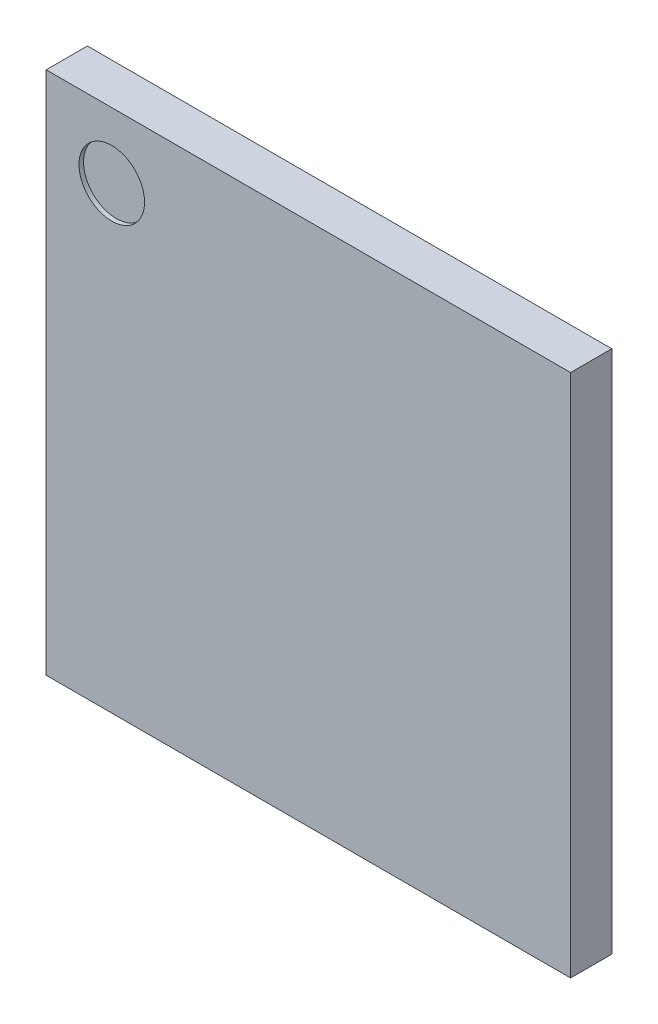
ISO-10303-21;
HEADER;
FILE_DESCRIPTION(('STEP AP214'),'2;1');
FILE_NAME('part.step','',(''),(''),'','','');
FILE_SCHEMA(('AUTOMOTIVE_DESIGN { 1 0 10303 214 1 1 1 1 }'));
ENDSEC;
DATA;
#1=APPLICATION_CONTEXT('core data for automotive mechanical design processes');
#2=APPLICATION_PROTOCOL_DEFINITION('international standard','automotive_design',2000,#1);
#3=PRODUCT_CONTEXT('',#1,'mechanical');
#4=PRODUCT('Part','Part','',(#3));
#5=PRODUCT_RELATED_PRODUCT_CATEGORY('part','',(#4));
#6=PRODUCT_DEFINITION_FORMATION('','',#4);
#7=PRODUCT_DEFINITION_CONTEXT('part definition',#1,'design');
#8=PRODUCT_DEFINITION('design','',#6,#7);
#9=PRODUCT_DEFINITION_SHAPE('','',#8);
#10=(LENGTH_UNIT() NAMED_UNIT(*) SI_UNIT(.MILLI.,.METRE.));
#11=(NAMED_UNIT(*) PLANE_ANGLE_UNIT() SI_UNIT($,.RADIAN.));
#12=(NAMED_UNIT(*) SI_UNIT($,.STERADIAN.) SOLID_ANGLE_UNIT());
#13=UNCERTAINTY_MEASURE_WITH_UNIT(LENGTH_MEASURE(1.E-05),#10,'distance_accuracy_value','');
#14=(GEOMETRIC_REPRESENTATION_CONTEXT(3) GLOBAL_UNCERTAINTY_ASSIGNED_CONTEXT((#13)) GLOBAL_UNIT_ASSIGNED_CONTEXT((#10,
#11,#12)) REPRESENTATION_CONTEXT('',''));
#15=CARTESIAN_POINT('',(0.,0.,0.));
#16=DIRECTION('',(0.,0.,1.));
#17=DIRECTION('',(1.,0.,0.));
#18=AXIS2_PLACEMENT_3D('',#15,#16,#17);
#19=CARTESIAN_POINT('',(-3.5,-3.5,0.05));
#20=DIRECTION('',(1.,0.,0.));
#21=DIRECTION('',(0.,0.,1.));
#22=AXIS2_PLACEMENT_3D('',#19,#20,#21);
#23=PLANE('',#22);
#24=DIRECTION('',(0.,1.,0.));
#25=VECTOR('',#24,1.);
#26=CARTESIAN_POINT('',(-3.5,-3.5,0.6));
#27=LINE('',#26,#25);
#28=CARTESIAN_POINT('',(-3.5,-3.5,0.6));
#29=VERTEX_POINT('',#28);
#30=CARTESIAN_POINT('',(-3.5,3.5,0.6));
#31=VERTEX_POINT('',#30);
#32=EDGE_CURVE('E11',#29,#31,#27,.T.);
#33=ORIENTED_EDGE('',*,*,#32,.T.);
#34=DIRECTION('',(0.,0.,1.));
#35=VECTOR('',#34,1.);
#36=CARTESIAN_POINT('',(-3.5,3.5,0.05));
#37=LINE('',#36,#35);
#38=CARTESIAN_POINT('',(-3.5,3.5,0.05));
#39=VERTEX_POINT('',#38);
#40=EDGE_CURVE('E23',#39,#31,#37,.T.);
#41=ORIENTED_EDGE('',*,*,#40,.F.);
#42=DIRECTION('',(0.,1.,0.));
#43=VECTOR('',#42,1.);
#44=CARTESIAN_POINT('',(-3.5,-3.5,0.05));
#45=LINE('',#44,#43);
#46=CARTESIAN_POINT('',(-3.5,-3.5,0.05));
#47=VERTEX_POINT('',#46);
#48=EDGE_CURVE('E94',#47,#39,#45,.T.);
#49=ORIENTED_EDGE('',*,*,#48,.F.);
#50=DIRECTION('',(0.,0.,1.));
#51=VECTOR('',#50,1.);
#52=CARTESIAN_POINT('',(-3.5,-3.5,0.05));
#53=LINE('',#52,#51);
#54=EDGE_CURVE('E35',#47,#29,#53,.T.);
#55=ORIENTED_EDGE('',*,*,#54,.T.);
#56=EDGE_LOOP('',(#33,#41,#49,#55));
#57=FACE_BOUND('',#56,.T.);
#58=ADVANCED_FACE('F16',(#57),#23,.F.);
#59=CARTESIAN_POINT('',(-3.5,-3.5,0.05));
#60=DIRECTION('',(0.,1.,0.));
#61=DIRECTION('',(0.,0.,1.));
#62=AXIS2_PLACEMENT_3D('',#59,#60,#61);
#63=PLANE('',#62);
#64=DIRECTION('',(0.,0.,1.));
#65=VECTOR('',#64,1.);
#66=CARTESIAN_POINT('',(3.5,-3.5,0.05));
#67=LINE('',#66,#65);
#68=CARTESIAN_POINT('',(3.5,-3.5,0.05));
#69=VERTEX_POINT('',#68);
#70=CARTESIAN_POINT('',(3.5,-3.5,0.6));
#71=VERTEX_POINT('',#70);
#72=EDGE_CURVE('E90',#69,#71,#67,.T.);
#73=ORIENTED_EDGE('',*,*,#72,.T.);
#74=DIRECTION('',(1.,0.,0.));
#75=VECTOR('',#74,1.);
#76=CARTESIAN_POINT('',(-3.5,-3.5,0.6));
#77=LINE('',#76,#75);
#78=EDGE_CURVE('E88',#29,#71,#77,.T.);
#79=ORIENTED_EDGE('',*,*,#78,.F.);
#80=ORIENTED_EDGE('',*,*,#54,.F.);
#81=DIRECTION('',(1.,0.,0.));
#82=VECTOR('',#81,1.);
#83=CARTESIAN_POINT('',(-3.5,-3.5,0.05));
#84=LINE('',#83,#82);
#85=EDGE_CURVE('E86',#47,#69,#84,.T.);
#86=ORIENTED_EDGE('',*,*,#85,.T.);
#87=EDGE_LOOP('',(#73,#79,#80,#86));
#88=FACE_BOUND('',#87,.T.);
#89=ADVANCED_FACE('F108',(#88),#63,.F.);
#90=CARTESIAN_POINT('',(-3.5,-3.5,0.6));
#91=DIRECTION('',(0.,0.,1.));
#92=DIRECTION('',(1.,0.,0.));
#93=AXIS2_PLACEMENT_3D('',#90,#91,#92);
#94=PLANE('',#93);
#95=ORIENTED_EDGE('',*,*,#32,.F.);
#96=ORIENTED_EDGE('',*,*,#78,.T.);
#97=DIRECTION('',(0.,1.,0.));
#98=VECTOR('',#97,1.);
#99=CARTESIAN_POINT('',(3.5,-3.5,0.6));
#100=LINE('',#99,#98);
#101=CARTESIAN_POINT('',(3.5,3.5,0.6));
#102=VERTEX_POINT('',#101);
#103=EDGE_CURVE('E84',#71,#102,#100,.T.);
#104=ORIENTED_EDGE('',*,*,#103,.T.);
#105=DIRECTION('',(1.,0.,0.));
#106=VECTOR('',#105,1.);
#107=CARTESIAN_POINT('',(-3.5,3.5,0.6));
#108=LINE('',#107,#106);
#109=EDGE_CURVE('E82',#31,#102,#108,.T.);
#110=ORIENTED_EDGE('',*,*,#109,.F.);
#111=EDGE_LOOP('',(#95,#96,#104,#110));
#112=FACE_BOUND('',#111,.T.);
#113=CARTESIAN_POINT('',(-2.625,2.625,0.6));
#114=DIRECTION('',(0.,0.,1.));
#115=DIRECTION('',(1.,0.,0.));
#116=AXIS2_PLACEMENT_3D('',#113,#114,#115);
#117=CIRCLE('',#116,0.4375);
#118=CARTESIAN_POINT('',(-2.1875,2.625,0.6));
#119=VERTEX_POINT('',#118);
#120=EDGE_CURVE('E67',#119,#119,#117,.T.);
#121=ORIENTED_EDGE('',*,*,#120,.F.);
#122=EDGE_LOOP('',(#121));
#123=FACE_BOUND('',#122,.T.);
#124=ADVANCED_FACE('F110',(#112,#123),#94,.T.);
#125=CARTESIAN_POINT('',(-3.5,3.5,0.05));
#126=DIRECTION('',(0.,1.,0.));
#127=DIRECTION('',(0.,0.,1.));
#128=AXIS2_PLACEMENT_3D('',#125,#126,#127);
#129=PLANE('',#128);
#130=DIRECTION('',(1.,0.,0.));
#131=VECTOR('',#130,1.);
#132=CARTESIAN_POINT('',(-3.5,3.5,0.05));
#133=LINE('',#132,#131);
#134=CARTESIAN_POINT('',(3.5,3.5,0.05));
#135=VERTEX_POINT('',#134);
#136=EDGE_CURVE('E79',#39,#135,#133,.T.);
#137=ORIENTED_EDGE('',*,*,#136,.F.);
#138=ORIENTED_EDGE('',*,*,#40,.T.);
#139=ORIENTED_EDGE('',*,*,#109,.T.);
#140=DIRECTION('',(0.,0.,1.));
#141=VECTOR('',#140,1.);
#142=CARTESIAN_POINT('',(3.5,3.5,0.05));
#143=LINE('',#142,#141);
#144=EDGE_CURVE('E74',#135,#102,#143,.T.);
#145=ORIENTED_EDGE('',*,*,#144,.F.);
#146=EDGE_LOOP('',(#137,#138,#139,#145));
#147=FACE_BOUND('',#146,.T.);
#148=ADVANCED_FACE('F101',(#147),#129,.T.);
#149=CARTESIAN_POINT('',(-3.5,-3.5,0.05));
#150=DIRECTION('',(0.,0.,1.));
#151=DIRECTION('',(1.,0.,0.));
#152=AXIS2_PLACEMENT_3D('',#149,#150,#151);
#153=PLANE('',#152);
#154=ORIENTED_EDGE('',*,*,#136,.T.);
#155=DIRECTION('',(0.,1.,0.));
#156=VECTOR('',#155,1.);
#157=CARTESIAN_POINT('',(3.5,-3.5,0.05));
#158=LINE('',#157,#156);
#159=EDGE_CURVE('E71',#69,#135,#158,.T.);
#160=ORIENTED_EDGE('',*,*,#159,.F.);
#161=ORIENTED_EDGE('',*,*,#85,.F.);
#162=ORIENTED_EDGE('',*,*,#48,.T.);
#163=EDGE_LOOP('',(#154,#160,#161,#162));
#164=FACE_BOUND('',#163,.T.);
#165=ADVANCED_FACE('F97',(#164),#153,.F.);
#166=CARTESIAN_POINT('',(3.5,-3.5,0.05));
#167=DIRECTION('',(1.,0.,0.));
#168=DIRECTION('',(0.,0.,1.));
#169=AXIS2_PLACEMENT_3D('',#166,#167,#168);
#170=PLANE('',#169);
#171=ORIENTED_EDGE('',*,*,#72,.F.);
#172=ORIENTED_EDGE('',*,*,#159,.T.);
#173=ORIENTED_EDGE('',*,*,#144,.T.);
#174=ORIENTED_EDGE('',*,*,#103,.F.);
#175=EDGE_LOOP('',(#171,#172,#173,#174));
#176=FACE_BOUND('',#175,.T.);
#177=ADVANCED_FACE('F105',(#176),#170,.T.);
#178=CARTESIAN_POINT('',(-2.625,2.625,0.54));
#179=DIRECTION('',(0.,0.,1.));
#180=DIRECTION('',(1.,0.,0.));
#181=AXIS2_PLACEMENT_3D('',#178,#179,#180);
#182=CYLINDRICAL_SURFACE('',#181,0.4375);
#183=CARTESIAN_POINT('',(-2.625,2.625,0.54));
#184=DIRECTION('',(0.,0.,1.));
#185=DIRECTION('',(1.,0.,0.));
#186=AXIS2_PLACEMENT_3D('',#183,#184,#185);
#187=CIRCLE('',#186,0.4375);
#188=CARTESIAN_POINT('',(-2.1875,2.625,0.54));
#189=VERTEX_POINT('',#188);
#190=EDGE_CURVE('E65',#189,#189,#187,.T.);
#191=ORIENTED_EDGE('',*,*,#190,.F.);
#192=DIRECTION('',(0.,0.,1.));
#193=VECTOR('',#192,1.);
#194=CARTESIAN_POINT('',(-2.1875,2.625,0.54));
#195=LINE('',#194,#193);
#196=EDGE_CURVE('E62',#189,#119,#195,.T.);
#197=ORIENTED_EDGE('',*,*,#196,.T.);
#198=ORIENTED_EDGE('',*,*,#120,.T.);
#199=ORIENTED_EDGE('',*,*,#196,.F.);
#200=EDGE_LOOP('',(#191,#197,#198,#199));
#201=FACE_BOUND('',#200,.T.);
#202=ADVANCED_FACE('F64',(#201),#182,.F.);
#203=CARTESIAN_POINT('',(-2.625,2.625,0.54));
#204=DIRECTION('',(0.,0.,1.));
#205=DIRECTION('',(1.,0.,0.));
#206=AXIS2_PLACEMENT_3D('',#203,#204,#205);
#207=PLANE('',#206);
#208=ORIENTED_EDGE('',*,*,#190,.T.);
#209=EDGE_LOOP('',(#208));
#210=FACE_BOUND('',#209,.T.);
#211=ADVANCED_FACE('F70',(#210),#207,.T.);
#212=CLOSED_SHELL('',(#58,#89,#124,#148,#165,#177,#202,#211));
#213=MANIFOLD_SOLID_BREP('B1',#212);
#214=ADVANCED_BREP_SHAPE_REPRESENTATION('',(#18,#213),#14);
#215=SHAPE_DEFINITION_REPRESENTATION(#9,#214);
ENDSEC;
END-ISO-10303-21;
